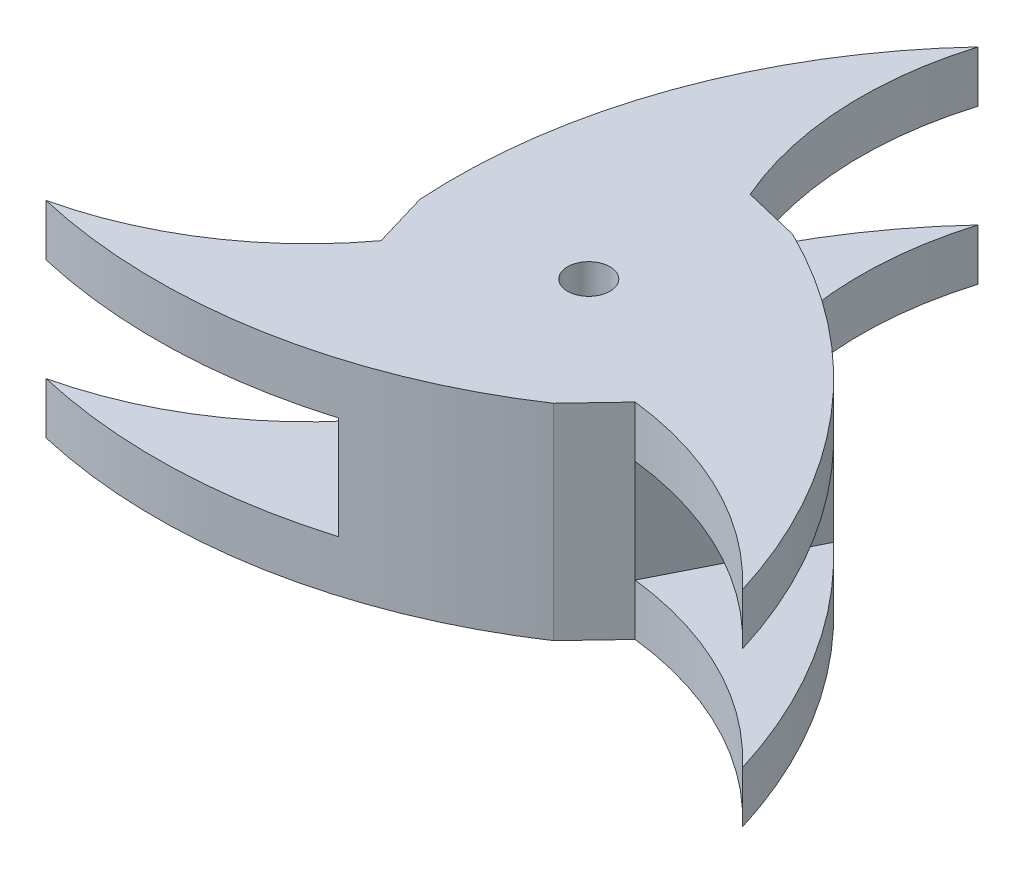
ISO-10303-21;
HEADER;
FILE_DESCRIPTION(('STEP AP214'),'2;1');
FILE_NAME('part.step','',(''),(''),'','','');
FILE_SCHEMA(('AUTOMOTIVE_DESIGN { 1 0 10303 214 1 1 1 1 }'));
ENDSEC;
DATA;
#1=APPLICATION_CONTEXT('core data for automotive mechanical design processes');
#2=APPLICATION_PROTOCOL_DEFINITION('international standard','automotive_design',2000,#1);
#3=PRODUCT_CONTEXT('',#1,'mechanical');
#4=PRODUCT('Part','Part','',(#3));
#5=PRODUCT_RELATED_PRODUCT_CATEGORY('part','',(#4));
#6=PRODUCT_DEFINITION_FORMATION('','',#4);
#7=PRODUCT_DEFINITION_CONTEXT('part definition',#1,'design');
#8=PRODUCT_DEFINITION('design','',#6,#7);
#9=PRODUCT_DEFINITION_SHAPE('','',#8);
#10=(LENGTH_UNIT() NAMED_UNIT(*) SI_UNIT(.MILLI.,.METRE.));
#11=(NAMED_UNIT(*) PLANE_ANGLE_UNIT() SI_UNIT($,.RADIAN.));
#12=(NAMED_UNIT(*) SI_UNIT($,.STERADIAN.) SOLID_ANGLE_UNIT());
#13=UNCERTAINTY_MEASURE_WITH_UNIT(LENGTH_MEASURE(1.E-05),#10,'distance_accuracy_value','');
#14=(GEOMETRIC_REPRESENTATION_CONTEXT(3) GLOBAL_UNCERTAINTY_ASSIGNED_CONTEXT((#13)) GLOBAL_UNIT_ASSIGNED_CONTEXT((#10,
#11,#12)) REPRESENTATION_CONTEXT('',''));
#15=CARTESIAN_POINT('',(0.,0.,0.));
#16=DIRECTION('',(0.,0.,1.));
#17=DIRECTION('',(1.,0.,0.));
#18=AXIS2_PLACEMENT_3D('',#15,#16,#17);
#19=CARTESIAN_POINT('',(-51.7167411393266,25.4,-17.0577686179308));
#20=DIRECTION('',(0.,-1.,0.));
#21=DIRECTION('',(0.,0.,-1.));
#22=AXIS2_PLACEMENT_3D('',#19,#20,#21);
#23=CYLINDRICAL_SURFACE('',#22,43.3000102379506);
#24=DIRECTION('',(0.,-1.,0.));
#25=VECTOR('',#24,1.);
#26=CARTESIAN_POINT('',(-41.9317834227738,25.4,25.1221494603668));
#27=LINE('',#26,#25);
#28=CARTESIAN_POINT('',(-41.9317834227738,6.35,25.1221494603668));
#29=VERTEX_POINT('',#28);
#30=CARTESIAN_POINT('',(-41.9317834227738,0.,25.1221494603668));
#31=VERTEX_POINT('',#30);
#32=EDGE_CURVE('E178',#29,#31,#27,.T.);
#33=ORIENTED_EDGE('',*,*,#32,.F.);
#34=CARTESIAN_POINT('',(-51.7167411393266,6.35,-17.0577686179308));
#35=DIRECTION('',(0.,-1.,0.));
#36=DIRECTION('',(0.,0.,-1.));
#37=AXIS2_PLACEMENT_3D('',#34,#35,#36);
#38=CIRCLE('',#37,43.3000102379506);
#39=CARTESIAN_POINT('',(-16.9325153497272,6.35,8.72882717959146));
#40=VERTEX_POINT('',#39);
#41=EDGE_CURVE('E164',#29,#40,#38,.F.);
#42=ORIENTED_EDGE('',*,*,#41,.T.);
#43=DIRECTION('',(0.,-1.,0.));
#44=VECTOR('',#43,1.);
#45=CARTESIAN_POINT('',(-16.9325153497272,25.4,8.72882717959146));
#46=LINE('',#45,#44);
#47=CARTESIAN_POINT('',(-16.9325153497272,0.,8.72882717959146));
#48=VERTEX_POINT('',#47);
#49=EDGE_CURVE('E188',#40,#48,#46,.T.);
#50=ORIENTED_EDGE('',*,*,#49,.T.);
#51=CARTESIAN_POINT('',(-51.7167411393266,0.,-17.0577686179308));
#52=DIRECTION('',(0.,-1.,0.));
#53=DIRECTION('',(0.,0.,1.));
#54=AXIS2_PLACEMENT_3D('',#51,#52,#53);
#55=CIRCLE('',#54,43.3000102379506);
#56=EDGE_CURVE('E182',#48,#31,#55,.T.);
#57=ORIENTED_EDGE('',*,*,#56,.T.);
#58=EDGE_LOOP('',(#33,#42,#50,#57));
#59=FACE_BOUND('',#58,.T.);
#60=ADVANCED_FACE('F39',(#59),#23,.F.);
#61=CARTESIAN_POINT('',(11.0859096146593,25.4,53.3168959365869));
#62=DIRECTION('',(0.,-1.,0.));
#63=DIRECTION('',(0.,0.,-1.));
#64=AXIS2_PLACEMENT_3D('',#61,#62,#63);
#65=CYLINDRICAL_SURFACE('',#64,43.3000102379505);
#66=DIRECTION('',(0.,-1.,0.));
#67=VECTOR('',#66,1.);
#68=CARTESIAN_POINT('',(42.7223113417351,25.4,23.7529149399468));
#69=LINE('',#68,#67);
#70=CARTESIAN_POINT('',(42.7223113417351,6.35,23.7529149399468));
#71=VERTEX_POINT('',#70);
#72=CARTESIAN_POINT('',(42.7223113417351,0.,23.7529149399468));
#73=VERTEX_POINT('',#72);
#74=EDGE_CURVE('E287',#71,#73,#69,.T.);
#75=ORIENTED_EDGE('',*,*,#74,.F.);
#76=CARTESIAN_POINT('',(11.0859096146593,6.35,53.3168959365869));
#77=DIRECTION('',(0.,-1.,0.));
#78=DIRECTION('',(1.,0.,0.));
#79=AXIS2_PLACEMENT_3D('',#76,#77,#78);
#80=CIRCLE('',#79,43.3000102379505);
#81=CARTESIAN_POINT('',(16.0256437576349,6.34999999999999,10.2995748530588));
#82=VERTEX_POINT('',#81);
#83=EDGE_CURVE('E223',#71,#82,#80,.F.);
#84=ORIENTED_EDGE('',*,*,#83,.T.);
#85=DIRECTION('',(0.,-1.,0.));
#86=VECTOR('',#85,1.);
#87=CARTESIAN_POINT('',(16.0256437576349,25.4,10.2995748530588));
#88=LINE('',#87,#86);
#89=CARTESIAN_POINT('',(16.0256437576349,0.,10.2995748530588));
#90=VERTEX_POINT('',#89);
#91=EDGE_CURVE('E311',#82,#90,#88,.T.);
#92=ORIENTED_EDGE('',*,*,#91,.T.);
#93=CARTESIAN_POINT('',(11.0859096146593,0.,53.3168959365869));
#94=DIRECTION('',(0.,-1.,0.));
#95=DIRECTION('',(0.,0.,1.));
#96=AXIS2_PLACEMENT_3D('',#93,#94,#95);
#97=CIRCLE('',#96,43.3000102379505);
#98=EDGE_CURVE('E271',#90,#73,#97,.T.);
#99=ORIENTED_EDGE('',*,*,#98,.T.);
#100=EDGE_LOOP('',(#75,#84,#92,#99));
#101=FACE_BOUND('',#100,.T.);
#102=ADVANCED_FACE('F319',(#101),#65,.F.);
#103=CARTESIAN_POINT('',(40.6308315246869,25.4,-36.2591273186257));
#104=DIRECTION('',(0.,-1.,0.));
#105=DIRECTION('',(0.,0.,-1.));
#106=AXIS2_PLACEMENT_3D('',#103,#104,#105);
#107=CYLINDRICAL_SURFACE('',#106,43.3000102379505);
#108=DIRECTION('',(0.,-1.,0.));
#109=VECTOR('',#108,1.);
#110=CARTESIAN_POINT('',(0.906871592111898,25.4,-19.02840203262));
#111=LINE('',#110,#109);
#112=CARTESIAN_POINT('',(0.906871592111898,25.4,-19.02840203262));
#113=VERTEX_POINT('',#112);
#114=CARTESIAN_POINT('',(0.906871592111898,19.05,-19.02840203262));
#115=VERTEX_POINT('',#114);
#116=EDGE_CURVE('E205',#113,#115,#111,.T.);
#117=ORIENTED_EDGE('',*,*,#116,.T.);
#118=CARTESIAN_POINT('',(40.6308315246869,19.05,-36.2591273186257));
#119=DIRECTION('',(0.,1.,0.));
#120=DIRECTION('',(-1.,0.,0.));
#121=AXIS2_PLACEMENT_3D('',#118,#119,#120);
#122=CIRCLE('',#121,43.3000102379505);
#123=CARTESIAN_POINT('',(-0.790527918941686,19.05,-48.8750644002832));
#124=VERTEX_POINT('',#123);
#125=EDGE_CURVE('E263',#115,#124,#122,.F.);
#126=ORIENTED_EDGE('',*,*,#125,.T.);
#127=DIRECTION('',(0.,-1.,0.));
#128=VECTOR('',#127,1.);
#129=CARTESIAN_POINT('',(-0.790527918941686,25.4,-48.8750644002832));
#130=LINE('',#129,#128);
#131=CARTESIAN_POINT('',(-0.790527918941686,25.4,-48.8750644002832));
#132=VERTEX_POINT('',#131);
#133=EDGE_CURVE('E201',#132,#124,#130,.T.);
#134=ORIENTED_EDGE('',*,*,#133,.F.);
#135=CARTESIAN_POINT('',(40.6308315246869,25.4,-36.2591273186257));
#136=DIRECTION('',(0.,-1.,0.));
#137=DIRECTION('',(0.,0.,1.));
#138=AXIS2_PLACEMENT_3D('',#135,#136,#137);
#139=CIRCLE('',#138,43.3000102379505);
#140=EDGE_CURVE('E273',#113,#132,#139,.T.);
#141=ORIENTED_EDGE('',*,*,#140,.F.);
#142=EDGE_LOOP('',(#117,#126,#134,#141));
#143=FACE_BOUND('',#142,.T.);
#144=ADVANCED_FACE('F364',(#143),#107,.F.);
#145=CARTESIAN_POINT('',(-22.346116085557,25.4,43.603668979189));
#146=DIRECTION('',(0.,-1.,0.));
#147=DIRECTION('',(0.,0.,-1.));
#148=AXIS2_PLACEMENT_3D('',#145,#146,#147);
#149=CYLINDRICAL_SURFACE('',#148,68.029057642946);
#150=DIRECTION('',(0.,-1.,0.));
#151=VECTOR('',#150,1.);
#152=CARTESIAN_POINT('',(24.2299046342069,25.4,-5.98087475874808));
#153=LINE('',#152,#151);
#154=CARTESIAN_POINT('',(24.2299046342069,19.05,-5.98087475874808));
#155=VERTEX_POINT('',#154);
#156=CARTESIAN_POINT('',(24.2299046342069,6.34999999999999,-5.98087475874807));
#157=VERTEX_POINT('',#156);
#158=EDGE_CURVE('E246',#155,#157,#153,.T.);
#159=ORIENTED_EDGE('',*,*,#158,.T.);
#160=CARTESIAN_POINT('',(-22.346116085557,6.34999999999999,43.603668979189));
#161=DIRECTION('',(0.,-1.,0.));
#162=DIRECTION('',(1.,0.,0.));
#163=AXIS2_PLACEMENT_3D('',#160,#161,#162);
#164=CIRCLE('',#163,68.029057642946);
#165=EDGE_CURVE('E249',#157,#71,#164,.T.);
#166=ORIENTED_EDGE('',*,*,#165,.T.);
#167=ORIENTED_EDGE('',*,*,#74,.T.);
#168=CARTESIAN_POINT('',(-22.346116085557,0.,43.603668979189));
#169=DIRECTION('',(0.,1.,0.));
#170=DIRECTION('',(0.,0.,1.));
#171=AXIS2_PLACEMENT_3D('',#168,#169,#170);
#172=CIRCLE('',#171,68.029057642946);
#173=CARTESIAN_POINT('',(7.82985910527496,0.,-17.3665139389355));
#174=VERTEX_POINT('',#173);
#175=EDGE_CURVE('E266',#73,#174,#172,.T.);
#176=ORIENTED_EDGE('',*,*,#175,.T.);
#177=DIRECTION('',(0.,-1.,0.));
#178=VECTOR('',#177,1.);
#179=CARTESIAN_POINT('',(7.82985910527496,25.4,-17.3665139389355));
#180=LINE('',#179,#178);
#181=CARTESIAN_POINT('',(7.82985910527496,25.4,-17.3665139389355));
#182=VERTEX_POINT('',#181);
#183=EDGE_CURVE('E208',#182,#174,#180,.T.);
#184=ORIENTED_EDGE('',*,*,#183,.F.);
#185=CARTESIAN_POINT('',(-22.346116085557,25.4,43.603668979189));
#186=DIRECTION('',(0.,1.,0.));
#187=DIRECTION('',(0.,0.,1.));
#188=AXIS2_PLACEMENT_3D('',#185,#186,#187);
#189=CIRCLE('',#188,68.029057642946);
#190=CARTESIAN_POINT('',(42.7223113417351,25.4,23.7529149399468));
#191=VERTEX_POINT('',#190);
#192=EDGE_CURVE('E267',#191,#182,#189,.T.);
#193=ORIENTED_EDGE('',*,*,#192,.F.);
#194=CARTESIAN_POINT('',(42.7223113417351,19.05,23.7529149399468));
#195=VERTEX_POINT('',#194);
#196=EDGE_CURVE('E309',#191,#195,#69,.T.);
#197=ORIENTED_EDGE('',*,*,#196,.T.);
#198=CARTESIAN_POINT('',(-22.346116085557,19.05,43.603668979189));
#199=DIRECTION('',(0.,1.,0.));
#200=DIRECTION('',(0.,0.,1.));
#201=AXIS2_PLACEMENT_3D('',#198,#199,#200);
#202=CIRCLE('',#201,68.029057642946);
#203=EDGE_CURVE('E242',#195,#155,#202,.T.);
#204=ORIENTED_EDGE('',*,*,#203,.T.);
#205=EDGE_LOOP('',(#159,#166,#167,#176,#184,#193,#197,#204));
#206=FACE_BOUND('',#205,.T.);
#207=ADVANCED_FACE('F41',(#206),#149,.T.);
#208=CARTESIAN_POINT('',(0.906871592111912,25.4,-19.0284020326199));
#209=DIRECTION('',(-0.23342223537242,0.,0.972375472764375));
#210=DIRECTION('',(0.972375472764376,0.,0.23342223537242));
#211=AXIS2_PLACEMENT_3D('',#208,#209,#210);
#212=PLANE('',#211);
#213=DIRECTION('',(-0.972375472764376,0.,-0.23342223537242));
#214=VECTOR('',#213,1.);
#215=CARTESIAN_POINT('',(0.906871592111912,0.,-19.0284020326199));
#216=LINE('',#215,#214);
#217=CARTESIAN_POINT('',(0.906871592111898,0.,-19.02840203262));
#218=VERTEX_POINT('',#217);
#219=EDGE_CURVE('E290',#174,#218,#216,.T.);
#220=ORIENTED_EDGE('',*,*,#219,.T.);
#221=CARTESIAN_POINT('',(0.906871592111898,6.35,-19.02840203262));
#222=VERTEX_POINT('',#221);
#223=EDGE_CURVE('E204',#222,#218,#111,.T.);
#224=ORIENTED_EDGE('',*,*,#223,.F.);
#225=DIRECTION('',(0.,-1.,0.));
#226=VECTOR('',#225,1.);
#227=CARTESIAN_POINT('',(0.906871592111898,19.05,-19.02840203262));
#228=LINE('',#227,#226);
#229=EDGE_CURVE('E252',#115,#222,#228,.T.);
#230=ORIENTED_EDGE('',*,*,#229,.F.);
#231=ORIENTED_EDGE('',*,*,#116,.F.);
#232=DIRECTION('',(-0.972375472764376,0.,-0.23342223537242));
#233=VECTOR('',#232,1.);
#234=CARTESIAN_POINT('',(0.906871592111912,25.4,-19.0284020326199));
#235=LINE('',#234,#233);
#236=EDGE_CURVE('E270',#182,#113,#235,.T.);
#237=ORIENTED_EDGE('',*,*,#236,.F.);
#238=ORIENTED_EDGE('',*,*,#183,.T.);
#239=EDGE_LOOP('',(#220,#224,#230,#231,#237,#238));
#240=FACE_BOUND('',#239,.T.);
#241=ADVANCED_FACE('F359',(#240),#212,.F.);
#242=CARTESIAN_POINT('',(-0.790527918941686,6.35,-48.8750644002832));
#243=VERTEX_POINT('',#242);
#244=CARTESIAN_POINT('',(-0.790527918941686,0.,-48.8750644002832));
#245=VERTEX_POINT('',#244);
#246=EDGE_CURVE('E200',#243,#245,#130,.T.);
#247=ORIENTED_EDGE('',*,*,#246,.F.);
#248=CARTESIAN_POINT('',(40.6308315246869,6.35,-36.2591273186257));
#249=DIRECTION('',(0.,-1.,0.));
#250=DIRECTION('',(1.,0.,0.));
#251=AXIS2_PLACEMENT_3D('',#248,#249,#250);
#252=CIRCLE('',#251,43.3000102379505);
#253=EDGE_CURVE('E258',#243,#222,#252,.F.);
#254=ORIENTED_EDGE('',*,*,#253,.T.);
#255=ORIENTED_EDGE('',*,*,#223,.T.);
#256=CARTESIAN_POINT('',(40.6308315246869,0.,-36.2591273186257));
#257=DIRECTION('',(0.,-1.,0.));
#258=DIRECTION('',(0.,0.,1.));
#259=AXIS2_PLACEMENT_3D('',#256,#257,#258);
#260=CIRCLE('',#259,43.3000102379505);
#261=EDGE_CURVE('E293',#218,#245,#260,.T.);
#262=ORIENTED_EDGE('',*,*,#261,.T.);
#263=EDGE_LOOP('',(#247,#254,#255,#262));
#264=FACE_BOUND('',#263,.T.);
#265=ADVANCED_FACE('F355',(#264),#107,.F.);
#266=CARTESIAN_POINT('',(48.9349430769647,25.4,-2.44953028356521));
#267=DIRECTION('',(0.,-1.,0.));
#268=DIRECTION('',(0.,0.,-1.));
#269=AXIS2_PLACEMENT_3D('',#266,#267,#268);
#270=CYLINDRICAL_SURFACE('',#269,68.029057642946);
#271=ORIENTED_EDGE('',*,*,#133,.T.);
#272=CARTESIAN_POINT('',(48.9349430769647,19.05,-2.44953028356521));
#273=DIRECTION('',(0.,1.,0.));
#274=DIRECTION('',(-1.,0.,0.));
#275=AXIS2_PLACEMENT_3D('',#272,#273,#274);
#276=CIRCLE('',#275,68.029057642946);
#277=CARTESIAN_POINT('',(-17.2945417950313,19.05,-17.9932755651027));
#278=VERTEX_POINT('',#277);
#279=EDGE_CURVE('E217',#124,#278,#276,.T.);
#280=ORIENTED_EDGE('',*,*,#279,.T.);
#281=DIRECTION('',(0.,-1.,0.));
#282=VECTOR('',#281,1.);
#283=CARTESIAN_POINT('',(-17.2945417950313,25.4,-17.9932755651026));
#284=LINE('',#283,#282);
#285=CARTESIAN_POINT('',(-17.2945417950313,6.35,-17.9932755651026));
#286=VERTEX_POINT('',#285);
#287=EDGE_CURVE('E211',#278,#286,#284,.T.);
#288=ORIENTED_EDGE('',*,*,#287,.T.);
#289=CARTESIAN_POINT('',(48.9349430769647,6.35,-2.44953028356521));
#290=DIRECTION('',(0.,-1.,0.));
#291=DIRECTION('',(1.,0.,0.));
#292=AXIS2_PLACEMENT_3D('',#289,#290,#291);
#293=CIRCLE('',#292,68.029057642946);
#294=EDGE_CURVE('E214',#286,#243,#293,.T.);
#295=ORIENTED_EDGE('',*,*,#294,.T.);
#296=ORIENTED_EDGE('',*,*,#246,.T.);
#297=CARTESIAN_POINT('',(48.9349430769647,0.,-2.44953028356521));
#298=DIRECTION('',(0.,1.,0.));
#299=DIRECTION('',(0.,0.,1.));
#300=AXIS2_PLACEMENT_3D('',#297,#298,#299);
#301=CIRCLE('',#300,68.029057642946);
#302=CARTESIAN_POINT('',(-18.9547717989312,0.,1.90240007626758));
#303=VERTEX_POINT('',#302);
#304=EDGE_CURVE('E296',#245,#303,#301,.T.);
#305=ORIENTED_EDGE('',*,*,#304,.T.);
#306=DIRECTION('',(0.,-1.,0.));
#307=VECTOR('',#306,1.);
#308=CARTESIAN_POINT('',(-18.9547717989312,25.4,1.90240007626758));
#309=LINE('',#308,#307);
#310=CARTESIAN_POINT('',(-18.9547717989312,25.4,1.90240007626758));
#311=VERTEX_POINT('',#310);
#312=EDGE_CURVE('E197',#311,#303,#309,.T.);
#313=ORIENTED_EDGE('',*,*,#312,.F.);
#314=CARTESIAN_POINT('',(48.9349430769647,25.4,-2.44953028356521));
#315=DIRECTION('',(0.,1.,0.));
#316=DIRECTION('',(0.,0.,1.));
#317=AXIS2_PLACEMENT_3D('',#314,#315,#316);
#318=CIRCLE('',#317,68.029057642946);
#319=EDGE_CURVE('E275',#132,#311,#318,.T.);
#320=ORIENTED_EDGE('',*,*,#319,.F.);
#321=EDGE_LOOP('',(#271,#280,#288,#295,#296,#305,#313,#320));
#322=FACE_BOUND('',#321,.T.);
#323=ADVANCED_FACE('F351',(#322),#270,.T.);
#324=CARTESIAN_POINT('',(-16.9325153497272,25.4,8.72882717959145));
#325=DIRECTION('',(0.958812979117063,0.,-0.284038150741522));
#326=DIRECTION('',(-0.284038150741522,0.,-0.958812979117063));
#327=AXIS2_PLACEMENT_3D('',#324,#325,#326);
#328=PLANE('',#327);
#329=DIRECTION('',(0.284038150741522,0.,0.958812979117063));
#330=VECTOR('',#329,1.);
#331=CARTESIAN_POINT('',(-16.9325153497272,0.,8.72882717959145));
#332=LINE('',#331,#330);
#333=EDGE_CURVE('E298',#303,#48,#332,.T.);
#334=ORIENTED_EDGE('',*,*,#333,.T.);
#335=ORIENTED_EDGE('',*,*,#49,.F.);
#336=DIRECTION('',(0.,-1.,0.));
#337=VECTOR('',#336,1.);
#338=CARTESIAN_POINT('',(-16.9325153497272,19.05,8.72882717959146));
#339=LINE('',#338,#337);
#340=CARTESIAN_POINT('',(-16.9325153497272,19.05,8.72882717959146));
#341=VERTEX_POINT('',#340);
#342=EDGE_CURVE('E569',#341,#40,#339,.T.);
#343=ORIENTED_EDGE('',*,*,#342,.F.);
#344=CARTESIAN_POINT('',(-16.9325153497272,25.4,8.72882717959146));
#345=VERTEX_POINT('',#344);
#346=EDGE_CURVE('E194',#345,#341,#46,.T.);
#347=ORIENTED_EDGE('',*,*,#346,.F.);
#348=DIRECTION('',(0.284038150741522,0.,0.958812979117063));
#349=VECTOR('',#348,1.);
#350=CARTESIAN_POINT('',(-16.9325153497272,25.4,8.72882717959145));
#351=LINE('',#350,#349);
#352=EDGE_CURVE('E277',#311,#345,#351,.T.);
#353=ORIENTED_EDGE('',*,*,#352,.F.);
#354=ORIENTED_EDGE('',*,*,#312,.T.);
#355=EDGE_LOOP('',(#334,#335,#343,#347,#353,#354));
#356=FACE_BOUND('',#355,.T.);
#357=ADVANCED_FACE('F345',(#356),#328,.F.);
#358=ORIENTED_EDGE('',*,*,#346,.T.);
#359=CARTESIAN_POINT('',(-51.7167411393266,19.05,-17.0577686179308));
#360=DIRECTION('',(0.,1.,0.));
#361=DIRECTION('',(-1.,0.,0.));
#362=AXIS2_PLACEMENT_3D('',#359,#360,#361);
#363=CIRCLE('',#362,43.3000102379506);
#364=CARTESIAN_POINT('',(-41.9317834227738,19.05,25.1221494603668));
#365=VERTEX_POINT('',#364);
#366=EDGE_CURVE('E173',#341,#365,#363,.F.);
#367=ORIENTED_EDGE('',*,*,#366,.T.);
#368=CARTESIAN_POINT('',(-41.9317834227738,25.4,25.1221494603668));
#369=VERTEX_POINT('',#368);
#370=EDGE_CURVE('E184',#369,#365,#27,.T.);
#371=ORIENTED_EDGE('',*,*,#370,.F.);
#372=CARTESIAN_POINT('',(-51.7167411393266,25.4,-17.0577686179308));
#373=DIRECTION('',(0.,-1.,0.));
#374=DIRECTION('',(0.,0.,1.));
#375=AXIS2_PLACEMENT_3D('',#372,#373,#374);
#376=CIRCLE('',#375,43.3000102379506);
#377=EDGE_CURVE('E279',#345,#369,#376,.T.);
#378=ORIENTED_EDGE('',*,*,#377,.F.);
#379=EDGE_LOOP('',(#358,#367,#371,#378));
#380=FACE_BOUND('',#379,.T.);
#381=ADVANCED_FACE('F232',(#380),#23,.F.);
#382=CARTESIAN_POINT('',(-26.5888269913881,25.4,-41.1541386955934));
#383=DIRECTION('',(0.,-1.,0.));
#384=DIRECTION('',(0.,0.,-1.));
#385=AXIS2_PLACEMENT_3D('',#382,#383,#384);
#386=CYLINDRICAL_SURFACE('',#385,68.029057642946);
#387=DIRECTION('',(0.,-1.,0.));
#388=VECTOR('',#387,1.);
#389=CARTESIAN_POINT('',(-6.93536283915596,25.4,23.974150323881));
#390=LINE('',#389,#388);
#391=CARTESIAN_POINT('',(-6.93536283915596,19.05,23.974150323881));
#392=VERTEX_POINT('',#391);
#393=CARTESIAN_POINT('',(-6.93536283915596,6.35,23.974150323881));
#394=VERTEX_POINT('',#393);
#395=EDGE_CURVE('E47',#392,#394,#390,.T.);
#396=ORIENTED_EDGE('',*,*,#395,.T.);
#397=CARTESIAN_POINT('',(-26.5888269913881,6.35,-41.1541386955934));
#398=DIRECTION('',(0.,-1.,0.));
#399=DIRECTION('',(0.,0.,-1.));
#400=AXIS2_PLACEMENT_3D('',#397,#398,#399);
#401=CIRCLE('',#400,68.029057642946);
#402=EDGE_CURVE('E11',#394,#29,#401,.T.);
#403=ORIENTED_EDGE('',*,*,#402,.T.);
#404=ORIENTED_EDGE('',*,*,#32,.T.);
#405=CARTESIAN_POINT('',(-26.5888269913881,0.,-41.1541386955934));
#406=DIRECTION('',(0.,1.,0.));
#407=DIRECTION('',(0.,0.,1.));
#408=AXIS2_PLACEMENT_3D('',#405,#406,#407);
#409=CIRCLE('',#408,68.029057642946);
#410=CARTESIAN_POINT('',(11.1249126936758,0.,15.4641138626983));
#411=VERTEX_POINT('',#410);
#412=EDGE_CURVE('E302',#31,#411,#409,.T.);
#413=ORIENTED_EDGE('',*,*,#412,.T.);
#414=DIRECTION('',(0.,-1.,0.));
#415=VECTOR('',#414,1.);
#416=CARTESIAN_POINT('',(11.1249126936758,25.4,15.4641138626983));
#417=LINE('',#416,#415);
#418=CARTESIAN_POINT('',(11.1249126936758,25.4,15.4641138626983));
#419=VERTEX_POINT('',#418);
#420=EDGE_CURVE('E185',#419,#411,#417,.T.);
#421=ORIENTED_EDGE('',*,*,#420,.F.);
#422=CARTESIAN_POINT('',(-26.5888269913881,25.4,-41.1541386955934));
#423=DIRECTION('',(0.,1.,0.));
#424=DIRECTION('',(0.,0.,1.));
#425=AXIS2_PLACEMENT_3D('',#422,#423,#424);
#426=CIRCLE('',#425,68.029057642946);
#427=EDGE_CURVE('E281',#369,#419,#426,.T.);
#428=ORIENTED_EDGE('',*,*,#427,.F.);
#429=ORIENTED_EDGE('',*,*,#370,.T.);
#430=CARTESIAN_POINT('',(-26.5888269913881,19.05,-41.1541386955934));
#431=DIRECTION('',(0.,1.,0.));
#432=DIRECTION('',(-1.,0.,0.));
#433=AXIS2_PLACEMENT_3D('',#430,#431,#432);
#434=CIRCLE('',#433,68.029057642946);
#435=EDGE_CURVE('E226',#365,#392,#434,.T.);
#436=ORIENTED_EDGE('',*,*,#435,.T.);
#437=EDGE_LOOP('',(#396,#403,#404,#413,#421,#428,#429,#436));
#438=FACE_BOUND('',#437,.T.);
#439=ADVANCED_FACE('F177',(#438),#386,.T.);
#440=CARTESIAN_POINT('',(11.1249126936758,25.4,15.4641138626983));
#441=DIRECTION('',(-0.725390743744643,0.,-0.688337322022853));
#442=DIRECTION('',(-0.688337322022854,0.,0.725390743744643));
#443=AXIS2_PLACEMENT_3D('',#440,#441,#442);
#444=PLANE('',#443);
#445=DIRECTION('',(0.688337322022854,0.,-0.725390743744643));
#446=VECTOR('',#445,1.);
#447=CARTESIAN_POINT('',(11.1249126936758,0.,15.4641138626983));
#448=LINE('',#447,#446);
#449=EDGE_CURVE('E304',#411,#90,#448,.T.);
#450=ORIENTED_EDGE('',*,*,#449,.T.);
#451=ORIENTED_EDGE('',*,*,#91,.F.);
#452=DIRECTION('',(0.,-1.,0.));
#453=VECTOR('',#452,1.);
#454=CARTESIAN_POINT('',(16.0256437576349,6.34999999999999,10.2995748530588));
#455=LINE('',#454,#453);
#456=CARTESIAN_POINT('',(16.0256437576349,19.05,10.2995748530588));
#457=VERTEX_POINT('',#456);
#458=EDGE_CURVE('E172',#457,#82,#455,.T.);
#459=ORIENTED_EDGE('',*,*,#458,.F.);
#460=CARTESIAN_POINT('',(16.0256437576349,25.4,10.2995748530588));
#461=VERTEX_POINT('',#460);
#462=EDGE_CURVE('E190',#461,#457,#88,.T.);
#463=ORIENTED_EDGE('',*,*,#462,.F.);
#464=DIRECTION('',(0.688337322022854,0.,-0.725390743744643));
#465=VECTOR('',#464,1.);
#466=CARTESIAN_POINT('',(11.1249126936758,25.4,15.4641138626983));
#467=LINE('',#466,#465);
#468=EDGE_CURVE('E283',#419,#461,#467,.T.);
#469=ORIENTED_EDGE('',*,*,#468,.F.);
#470=ORIENTED_EDGE('',*,*,#420,.T.);
#471=EDGE_LOOP('',(#450,#451,#459,#463,#469,#470));
#472=FACE_BOUND('',#471,.T.);
#473=ADVANCED_FACE('F325',(#472),#444,.F.);
#474=ORIENTED_EDGE('',*,*,#462,.T.);
#475=CARTESIAN_POINT('',(11.0859096146593,19.05,53.3168959365869));
#476=DIRECTION('',(0.,1.,0.));
#477=DIRECTION('',(0.,0.,1.));
#478=AXIS2_PLACEMENT_3D('',#475,#476,#477);
#479=CIRCLE('',#478,43.3000102379505);
#480=EDGE_CURVE('E220',#457,#195,#479,.F.);
#481=ORIENTED_EDGE('',*,*,#480,.T.);
#482=ORIENTED_EDGE('',*,*,#196,.F.);
#483=CARTESIAN_POINT('',(11.0859096146593,25.4,53.3168959365869));
#484=DIRECTION('',(0.,-1.,0.));
#485=DIRECTION('',(0.,0.,1.));
#486=AXIS2_PLACEMENT_3D('',#483,#484,#485);
#487=CIRCLE('',#486,43.3000102379505);
#488=EDGE_CURVE('E285',#461,#191,#487,.T.);
#489=ORIENTED_EDGE('',*,*,#488,.F.);
#490=EDGE_LOOP('',(#474,#481,#482,#489));
#491=FACE_BOUND('',#490,.T.);
#492=ADVANCED_FACE('F339',(#491),#65,.F.);
#493=CARTESIAN_POINT('',(-22.346116085557,25.4,43.603668979189));
#494=DIRECTION('',(0.,1.,0.));
#495=DIRECTION('',(0.,0.,1.));
#496=AXIS2_PLACEMENT_3D('',#493,#494,#495);
#497=PLANE('',#496);
#498=CARTESIAN_POINT('',(0.,25.4,0.));
#499=DIRECTION('',(0.,1.,0.));
#500=DIRECTION('',(0.,0.,1.));
#501=AXIS2_PLACEMENT_3D('',#498,#499,#500);
#502=CIRCLE('',#501,2.62598460906711);
#503=CARTESIAN_POINT('',(0.,25.4,2.62598460906711));
#504=VERTEX_POINT('',#503);
#505=EDGE_CURVE('E568',#504,#504,#502,.T.);
#506=ORIENTED_EDGE('',*,*,#505,.F.);
#507=EDGE_LOOP('',(#506));
#508=FACE_BOUND('',#507,.T.);
#509=ORIENTED_EDGE('',*,*,#192,.T.);
#510=ORIENTED_EDGE('',*,*,#236,.T.);
#511=ORIENTED_EDGE('',*,*,#140,.T.);
#512=ORIENTED_EDGE('',*,*,#319,.T.);
#513=ORIENTED_EDGE('',*,*,#352,.T.);
#514=ORIENTED_EDGE('',*,*,#377,.T.);
#515=ORIENTED_EDGE('',*,*,#427,.T.);
#516=ORIENTED_EDGE('',*,*,#468,.T.);
#517=ORIENTED_EDGE('',*,*,#488,.T.);
#518=EDGE_LOOP('',(#509,#510,#511,#512,#513,#514,#515,#516,#517));
#519=FACE_BOUND('',#518,.T.);
#520=ADVANCED_FACE('F341',(#508,#519),#497,.T.);
#521=CARTESIAN_POINT('',(-22.346116085557,0.,43.603668979189));
#522=DIRECTION('',(0.,1.,0.));
#523=DIRECTION('',(0.,0.,1.));
#524=AXIS2_PLACEMENT_3D('',#521,#522,#523);
#525=PLANE('',#524);
#526=CARTESIAN_POINT('',(0.,0.,0.));
#527=DIRECTION('',(0.,1.,0.));
#528=DIRECTION('',(0.,0.,1.));
#529=AXIS2_PLACEMENT_3D('',#526,#527,#528);
#530=CIRCLE('',#529,2.62598460906711);
#531=CARTESIAN_POINT('',(0.,0.,2.62598460906711));
#532=VERTEX_POINT('',#531);
#533=EDGE_CURVE('E570',#532,#532,#530,.T.);
#534=ORIENTED_EDGE('',*,*,#533,.T.);
#535=EDGE_LOOP('',(#534));
#536=FACE_BOUND('',#535,.T.);
#537=ORIENTED_EDGE('',*,*,#175,.F.);
#538=ORIENTED_EDGE('',*,*,#98,.F.);
#539=ORIENTED_EDGE('',*,*,#449,.F.);
#540=ORIENTED_EDGE('',*,*,#412,.F.);
#541=ORIENTED_EDGE('',*,*,#56,.F.);
#542=ORIENTED_EDGE('',*,*,#333,.F.);
#543=ORIENTED_EDGE('',*,*,#304,.F.);
#544=ORIENTED_EDGE('',*,*,#261,.F.);
#545=ORIENTED_EDGE('',*,*,#219,.F.);
#546=EDGE_LOOP('',(#537,#538,#539,#540,#541,#542,#543,#544,#545));
#547=FACE_BOUND('',#546,.T.);
#548=ADVANCED_FACE('F329',(#536,#547),#525,.F.);
#549=CARTESIAN_POINT('',(-26.1495520276157,19.05,-47.4328798574147));
#550=DIRECTION('',(0.,1.,0.));
#551=DIRECTION('',(-1.,0.,0.));
#552=AXIS2_PLACEMENT_3D('',#549,#550,#551);
#553=PLANE('',#552);
#554=DIRECTION('',(0.998386775932049,0.,-0.0567789190105716));
#555=VECTOR('',#554,1.);
#556=CARTESIAN_POINT('',(-24.4521525165621,19.05,-17.5862174897514));
#557=LINE('',#556,#555);
#558=EDGE_CURVE('E255',#278,#115,#557,.T.);
#559=ORIENTED_EDGE('',*,*,#558,.F.);
#560=ORIENTED_EDGE('',*,*,#279,.F.);
#561=ORIENTED_EDGE('',*,*,#125,.F.);
#562=EDGE_LOOP('',(#559,#560,#561));
#563=FACE_BOUND('',#562,.T.);
#564=ADVANCED_FACE('F367',(#563),#553,.F.);
#565=CARTESIAN_POINT('',(-24.4521525165621,6.35,-17.5862174897514));
#566=DIRECTION('',(0.,-1.,0.));
#567=DIRECTION('',(1.,0.,0.));
#568=AXIS2_PLACEMENT_3D('',#565,#566,#567);
#569=PLANE('',#568);
#570=ORIENTED_EDGE('',*,*,#294,.F.);
#571=DIRECTION('',(0.998386775932049,0.,-0.0567789190105716));
#572=VECTOR('',#571,1.);
#573=CARTESIAN_POINT('',(-24.4521525165621,6.35,-17.5862174897514));
#574=LINE('',#573,#572);
#575=EDGE_CURVE('E256',#286,#222,#574,.T.);
#576=ORIENTED_EDGE('',*,*,#575,.T.);
#577=ORIENTED_EDGE('',*,*,#253,.F.);
#578=EDGE_LOOP('',(#570,#576,#577));
#579=FACE_BOUND('',#578,.T.);
#580=ADVANCED_FACE('F371',(#579),#569,.F.);
#581=CARTESIAN_POINT('',(-24.4521525165621,19.05,-17.5862174897514));
#582=DIRECTION('',(0.0567789190105716,0.,0.998386775932049));
#583=DIRECTION('',(0.998386775932049,0.,-0.0567789190105716));
#584=AXIS2_PLACEMENT_3D('',#581,#582,#583);
#585=PLANE('',#584);
#586=ORIENTED_EDGE('',*,*,#558,.T.);
#587=ORIENTED_EDGE('',*,*,#229,.T.);
#588=ORIENTED_EDGE('',*,*,#575,.F.);
#589=ORIENTED_EDGE('',*,*,#287,.F.);
#590=EDGE_LOOP('',(#586,#587,#588,#589));
#591=FACE_BOUND('',#590,.T.);
#592=ADVANCED_FACE('F369',(#591),#585,.F.);
#593=CARTESIAN_POINT('',(54.1528549450027,6.35,1.07026357521875));
#594=DIRECTION('',(0.,-1.,0.));
#595=DIRECTION('',(1.,0.,0.));
#596=AXIS2_PLACEMENT_3D('',#593,#594,#595);
#597=PLANE('',#596);
#598=DIRECTION('',(-0.450021401703449,0.,0.893017770264883));
#599=VECTOR('',#598,1.);
#600=CARTESIAN_POINT('',(27.4561873609025,6.34999999999999,-12.3830765116692));
#601=LINE('',#600,#599);
#602=EDGE_CURVE('E240',#157,#82,#601,.T.);
#603=ORIENTED_EDGE('',*,*,#602,.T.);
#604=ORIENTED_EDGE('',*,*,#83,.F.);
#605=ORIENTED_EDGE('',*,*,#165,.F.);
#606=EDGE_LOOP('',(#603,#604,#605));
#607=FACE_BOUND('',#606,.T.);
#608=ADVANCED_FACE('F336',(#607),#597,.F.);
#609=CARTESIAN_POINT('',(27.4561873609025,6.34999999999999,-12.3830765116692));
#610=DIRECTION('',(-0.893017770264883,0.,-0.450021401703449));
#611=DIRECTION('',(-0.450021401703449,0.,0.893017770264883));
#612=AXIS2_PLACEMENT_3D('',#609,#610,#611);
#613=PLANE('',#612);
#614=DIRECTION('',(-0.450021401703449,0.,0.893017770264883));
#615=VECTOR('',#614,1.);
#616=CARTESIAN_POINT('',(27.4561873609025,19.05,-12.3830765116692));
#617=LINE('',#616,#615);
#618=EDGE_CURVE('E62',#155,#457,#617,.T.);
#619=ORIENTED_EDGE('',*,*,#618,.T.);
#620=ORIENTED_EDGE('',*,*,#458,.T.);
#621=ORIENTED_EDGE('',*,*,#602,.F.);
#622=ORIENTED_EDGE('',*,*,#158,.F.);
#623=EDGE_LOOP('',(#619,#620,#621,#622));
#624=FACE_BOUND('',#623,.T.);
#625=ADVANCED_FACE('F337',(#624),#613,.F.);
#626=CARTESIAN_POINT('',(27.4561873609025,19.05,-12.3830765116692));
#627=DIRECTION('',(0.,1.,0.));
#628=DIRECTION('',(0.,0.,1.));
#629=AXIS2_PLACEMENT_3D('',#626,#627,#628);
#630=PLANE('',#629);
#631=ORIENTED_EDGE('',*,*,#480,.F.);
#632=ORIENTED_EDGE('',*,*,#618,.F.);
#633=ORIENTED_EDGE('',*,*,#203,.F.);
#634=EDGE_LOOP('',(#631,#632,#633));
#635=FACE_BOUND('',#634,.T.);
#636=ADVANCED_FACE('F450',(#635),#630,.F.);
#637=CARTESIAN_POINT('',(-3.00403484432083,6.35,29.969294001451));
#638=DIRECTION('',(0.,-1.,0.));
#639=DIRECTION('',(0.,0.,-1.));
#640=AXIS2_PLACEMENT_3D('',#637,#638,#639);
#641=PLANE('',#640);
#642=ORIENTED_EDGE('',*,*,#402,.F.);
#643=DIRECTION('',(-0.548365374228598,0.,-0.836238851254311));
#644=VECTOR('',#643,1.);
#645=CARTESIAN_POINT('',(-3.00403484432083,6.35,29.969294001451));
#646=LINE('',#645,#644);
#647=EDGE_CURVE('E167',#394,#40,#646,.T.);
#648=ORIENTED_EDGE('',*,*,#647,.T.);
#649=ORIENTED_EDGE('',*,*,#41,.F.);
#650=EDGE_LOOP('',(#642,#648,#649));
#651=FACE_BOUND('',#650,.T.);
#652=ADVANCED_FACE('F165',(#651),#641,.F.);
#653=CARTESIAN_POINT('',(-3.00403484432083,19.05,29.969294001451));
#654=DIRECTION('',(0.836238851254311,0.,-0.548365374228598));
#655=DIRECTION('',(-0.548365374228598,0.,-0.836238851254311));
#656=AXIS2_PLACEMENT_3D('',#653,#654,#655);
#657=PLANE('',#656);
#658=DIRECTION('',(-0.548365374228598,0.,-0.836238851254311));
#659=VECTOR('',#658,1.);
#660=CARTESIAN_POINT('',(-3.00403484432083,19.05,29.969294001451));
#661=LINE('',#660,#659);
#662=EDGE_CURVE('E54',#392,#341,#661,.T.);
#663=ORIENTED_EDGE('',*,*,#662,.T.);
#664=ORIENTED_EDGE('',*,*,#342,.T.);
#665=ORIENTED_EDGE('',*,*,#647,.F.);
#666=ORIENTED_EDGE('',*,*,#395,.F.);
#667=EDGE_LOOP('',(#663,#664,#665,#666));
#668=FACE_BOUND('',#667,.T.);
#669=ADVANCED_FACE('F469',(#668),#657,.F.);
#670=CARTESIAN_POINT('',(-28.0033029173674,19.05,46.3626162822263));
#671=DIRECTION('',(0.,1.,0.));
#672=DIRECTION('',(-1.,0.,0.));
#673=AXIS2_PLACEMENT_3D('',#670,#671,#672);
#674=PLANE('',#673);
#675=ORIENTED_EDGE('',*,*,#662,.F.);
#676=ORIENTED_EDGE('',*,*,#435,.F.);
#677=ORIENTED_EDGE('',*,*,#366,.F.);
#678=EDGE_LOOP('',(#675,#676,#677));
#679=FACE_BOUND('',#678,.T.);
#680=ADVANCED_FACE('F230',(#679),#674,.F.);
#681=CARTESIAN_POINT('',(0.,25.4,0.));
#682=DIRECTION('',(0.,-1.,0.));
#683=DIRECTION('',(0.,0.,-1.));
#684=AXIS2_PLACEMENT_3D('',#681,#682,#683);
#685=CYLINDRICAL_SURFACE('',#684,2.62598460906711);
#686=ORIENTED_EDGE('',*,*,#505,.T.);
#687=EDGE_LOOP('',(#686));
#688=FACE_BOUND('',#687,.T.);
#689=ORIENTED_EDGE('',*,*,#533,.F.);
#690=EDGE_LOOP('',(#689));
#691=FACE_BOUND('',#690,.T.);
#692=ADVANCED_FACE('F485',(#688,#691),#685,.F.);
#693=CLOSED_SHELL('',(#60,#102,#144,#207,#241,#265,#323,#357,#381,#439,#473,#492,#520,#548,#564,
#580,#592,#608,#625,#636,#652,#669,#680,#692));
#694=MANIFOLD_SOLID_BREP('B2',#693);
#695=ADVANCED_BREP_SHAPE_REPRESENTATION('',(#18,#694),#14);
#696=SHAPE_DEFINITION_REPRESENTATION(#9,#695);
ENDSEC;
END-ISO-10303-21;
